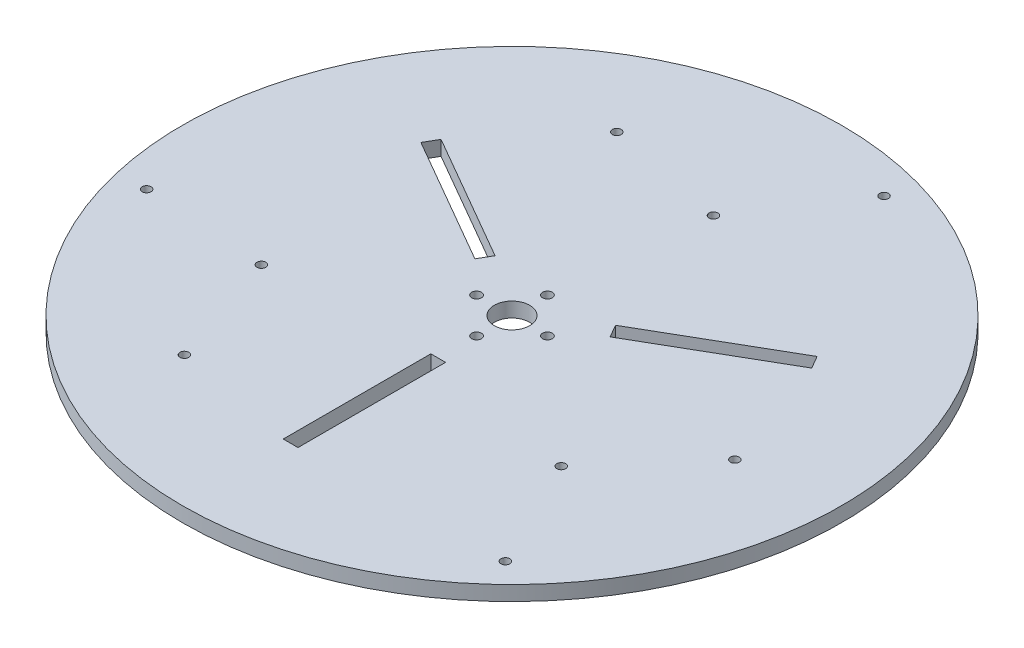
ISO-10303-21;
HEADER;
FILE_DESCRIPTION(('STEP AP214'),'2;1');
FILE_NAME('part.step','',(''),(''),'','','');
FILE_SCHEMA(('AUTOMOTIVE_DESIGN { 1 0 10303 214 1 1 1 1 }'));
ENDSEC;
DATA;
#1=APPLICATION_CONTEXT('core data for automotive mechanical design processes');
#2=APPLICATION_PROTOCOL_DEFINITION('international standard','automotive_design',2000,#1);
#3=PRODUCT_CONTEXT('',#1,'mechanical');
#4=PRODUCT('Part','Part','',(#3));
#5=PRODUCT_RELATED_PRODUCT_CATEGORY('part','',(#4));
#6=PRODUCT_DEFINITION_FORMATION('','',#4);
#7=PRODUCT_DEFINITION_CONTEXT('part definition',#1,'design');
#8=PRODUCT_DEFINITION('design','',#6,#7);
#9=PRODUCT_DEFINITION_SHAPE('','',#8);
#10=(LENGTH_UNIT() NAMED_UNIT(*) SI_UNIT(.MILLI.,.METRE.));
#11=(NAMED_UNIT(*) PLANE_ANGLE_UNIT() SI_UNIT($,.RADIAN.));
#12=(NAMED_UNIT(*) SI_UNIT($,.STERADIAN.) SOLID_ANGLE_UNIT());
#13=UNCERTAINTY_MEASURE_WITH_UNIT(LENGTH_MEASURE(1.E-05),#10,'distance_accuracy_value','');
#14=(GEOMETRIC_REPRESENTATION_CONTEXT(3) GLOBAL_UNCERTAINTY_ASSIGNED_CONTEXT((#13)) GLOBAL_UNIT_ASSIGNED_CONTEXT((#10,
#11,#12)) REPRESENTATION_CONTEXT('',''));
#15=CARTESIAN_POINT('',(0.,0.,0.));
#16=DIRECTION('',(0.,0.,1.));
#17=DIRECTION('',(1.,0.,0.));
#18=AXIS2_PLACEMENT_3D('',#15,#16,#17);
#19=CARTESIAN_POINT('',(0.,-5.,0.));
#20=DIRECTION('',(0.,1.,0.));
#21=DIRECTION('',(0.,0.,1.));
#22=AXIS2_PLACEMENT_3D('',#19,#20,#21);
#23=PLANE('',#22);
#24=CARTESIAN_POINT('',(0.,-5.,-12.));
#25=DIRECTION('',(0.,1.,0.));
#26=DIRECTION('',(0.,0.,1.));
#27=AXIS2_PLACEMENT_3D('',#24,#25,#26);
#28=CIRCLE('',#27,1.65);
#29=CARTESIAN_POINT('',(0.,-5.,-10.35));
#30=VERTEX_POINT('',#29);
#31=EDGE_CURVE('E496',#30,#30,#28,.T.);
#32=ORIENTED_EDGE('',*,*,#31,.T.);
#33=EDGE_LOOP('',(#32));
#34=FACE_BOUND('',#33,.T.);
#35=CARTESIAN_POINT('',(12.,-5.,0.));
#36=DIRECTION('',(0.,1.,0.));
#37=DIRECTION('',(0.,0.,1.));
#38=AXIS2_PLACEMENT_3D('',#35,#36,#37);
#39=CIRCLE('',#38,1.65);
#40=CARTESIAN_POINT('',(12.,-5.,1.64999999999999));
#41=VERTEX_POINT('',#40);
#42=EDGE_CURVE('E506',#41,#41,#39,.T.);
#43=ORIENTED_EDGE('',*,*,#42,.T.);
#44=EDGE_LOOP('',(#43));
#45=FACE_BOUND('',#44,.T.);
#46=CARTESIAN_POINT('',(0.,-5.,12.));
#47=DIRECTION('',(0.,1.,0.));
#48=DIRECTION('',(0.,0.,1.));
#49=AXIS2_PLACEMENT_3D('',#46,#47,#48);
#50=CIRCLE('',#49,1.65);
#51=CARTESIAN_POINT('',(0.,-5.,13.65));
#52=VERTEX_POINT('',#51);
#53=EDGE_CURVE('E512',#52,#52,#50,.T.);
#54=ORIENTED_EDGE('',*,*,#53,.T.);
#55=EDGE_LOOP('',(#54));
#56=FACE_BOUND('',#55,.T.);
#57=CARTESIAN_POINT('',(-12.,-5.,0.));
#58=DIRECTION('',(0.,1.,0.));
#59=DIRECTION('',(0.,0.,1.));
#60=AXIS2_PLACEMENT_3D('',#57,#58,#59);
#61=CIRCLE('',#60,1.65);
#62=CARTESIAN_POINT('',(-12.,-5.,1.65));
#63=VERTEX_POINT('',#62);
#64=EDGE_CURVE('E518',#63,#63,#61,.T.);
#65=ORIENTED_EDGE('',*,*,#64,.T.);
#66=EDGE_LOOP('',(#65));
#67=FACE_BOUND('',#66,.T.);
#68=CARTESIAN_POINT('',(80.0323126268361,-5.,4.54093631966197));
#69=DIRECTION('',(0.,1.,0.));
#70=DIRECTION('',(0.,0.,1.));
#71=AXIS2_PLACEMENT_3D('',#68,#69,#70);
#72=CIRCLE('',#71,1.49999999999999);
#73=CARTESIAN_POINT('',(80.0323126268361,-5.,6.04093631966196));
#74=VERTEX_POINT('',#73);
#75=EDGE_CURVE('E524',#74,#74,#72,.T.);
#76=ORIENTED_EDGE('',*,*,#75,.T.);
#77=EDGE_LOOP('',(#76));
#78=FACE_BOUND('',#77,.T.);
#79=CARTESIAN_POINT('',(52.5588445166589,-5.,35.8684225972486));
#80=DIRECTION('',(0.,1.,0.));
#81=DIRECTION('',(0.,0.,1.));
#82=AXIS2_PLACEMENT_3D('',#79,#80,#81);
#83=CIRCLE('',#82,1.49999999999999);
#84=CARTESIAN_POINT('',(52.5588445166589,-5.,37.3684225972486));
#85=VERTEX_POINT('',#84);
#86=EDGE_CURVE('E530',#85,#85,#83,.T.);
#87=ORIENTED_EDGE('',*,*,#86,.T.);
#88=EDGE_LOOP('',(#87));
#89=FACE_BOUND('',#88,.T.);
#90=CARTESIAN_POINT('',(70.9880268181769,-5.,73.2391074474209));
#91=DIRECTION('',(0.,1.,0.));
#92=DIRECTION('',(0.,0.,1.));
#93=AXIS2_PLACEMENT_3D('',#90,#91,#92);
#94=CIRCLE('',#93,1.49999999999999);
#95=CARTESIAN_POINT('',(70.9880268181769,-5.,74.7391074474209));
#96=VERTEX_POINT('',#95);
#97=EDGE_CURVE('E536',#96,#96,#94,.T.);
#98=ORIENTED_EDGE('',*,*,#97,.T.);
#99=EDGE_LOOP('',(#98));
#100=FACE_BOUND('',#99,.T.);
#101=CARTESIAN_POINT('',(-36.0835901036237,-5.,-71.580484018289));
#102=DIRECTION('',(0.,1.,0.));
#103=DIRECTION('',(0.,0.,1.));
#104=AXIS2_PLACEMENT_3D('',#101,#102,#103);
#105=CIRCLE('',#104,1.49999999999999);
#106=CARTESIAN_POINT('',(-36.0835901036237,-5.,-70.080484018289));
#107=VERTEX_POINT('',#106);
#108=EDGE_CURVE('E542',#107,#107,#105,.T.);
#109=ORIENTED_EDGE('',*,*,#108,.T.);
#110=EDGE_LOOP('',(#109));
#111=FACE_BOUND('',#110,.T.);
#112=CARTESIAN_POINT('',(4.7835429045634,-5.,-63.4515058436074));
#113=DIRECTION('',(0.,1.,0.));
#114=DIRECTION('',(0.,0.,1.));
#115=AXIS2_PLACEMENT_3D('',#112,#113,#114);
#116=CIRCLE('',#115,1.49999999999999);
#117=CARTESIAN_POINT('',(4.7835429045634,-5.,-61.9515058436074));
#118=VERTEX_POINT('',#117);
#119=EDGE_CURVE('E548',#118,#118,#116,.T.);
#120=ORIENTED_EDGE('',*,*,#119,.T.);
#121=EDGE_LOOP('',(#120));
#122=FACE_BOUND('',#121,.T.);
#123=CARTESIAN_POINT('',(27.9329141908757,-5.,-98.0969883127829));
#124=DIRECTION('',(0.,1.,0.));
#125=DIRECTION('',(0.,0.,1.));
#126=AXIS2_PLACEMENT_3D('',#123,#124,#125);
#127=CIRCLE('',#126,1.49999999999999);
#128=CARTESIAN_POINT('',(27.9329141908757,-5.,-96.5969883127829));
#129=VERTEX_POINT('',#128);
#130=EDGE_CURVE('E554',#129,#129,#127,.T.);
#131=ORIENTED_EDGE('',*,*,#130,.T.);
#132=EDGE_LOOP('',(#131));
#133=FACE_BOUND('',#132,.T.);
#134=CARTESIAN_POINT('',(-43.9487225232121,-5.,67.0395476986276));
#135=DIRECTION('',(0.,1.,0.));
#136=DIRECTION('',(0.,0.,1.));
#137=AXIS2_PLACEMENT_3D('',#134,#135,#136);
#138=CIRCLE('',#137,1.49999999999999);
#139=CARTESIAN_POINT('',(-43.9487225232121,-5.,68.5395476986276));
#140=VERTEX_POINT('',#139);
#141=EDGE_CURVE('E560',#140,#140,#138,.T.);
#142=ORIENTED_EDGE('',*,*,#141,.T.);
#143=EDGE_LOOP('',(#142));
#144=FACE_BOUND('',#143,.T.);
#145=CARTESIAN_POINT('',(-57.3423874212223,-5.,27.5830832463593));
#146=DIRECTION('',(0.,1.,0.));
#147=DIRECTION('',(0.,0.,1.));
#148=AXIS2_PLACEMENT_3D('',#145,#146,#147);
#149=CIRCLE('',#148,1.49999999999999);
#150=CARTESIAN_POINT('',(-57.3423874212223,-5.,29.0830832463593));
#151=VERTEX_POINT('',#150);
#152=EDGE_CURVE('E566',#151,#151,#149,.T.);
#153=ORIENTED_EDGE('',*,*,#152,.T.);
#154=EDGE_LOOP('',(#153));
#155=FACE_BOUND('',#154,.T.);
#156=CARTESIAN_POINT('',(-98.9209410090528,-5.,24.8578808653627));
#157=DIRECTION('',(0.,1.,0.));
#158=DIRECTION('',(0.,0.,1.));
#159=AXIS2_PLACEMENT_3D('',#156,#157,#158);
#160=CIRCLE('',#159,1.49999999999999);
#161=CARTESIAN_POINT('',(-98.9209410090528,-5.,26.3578808653627));
#162=VERTEX_POINT('',#161);
#163=EDGE_CURVE('E572',#162,#162,#160,.T.);
#164=ORIENTED_EDGE('',*,*,#163,.T.);
#165=EDGE_LOOP('',(#164));
#166=FACE_BOUND('',#165,.T.);
#167=DIRECTION('',(-0.500000000000002,0.,-0.866025403784437));
#168=VECTOR('',#167,1.);
#169=CARTESIAN_POINT('',(21.6506350946136,-5.,-12.5000000000016));
#170=LINE('',#169,#168);
#171=CARTESIAN_POINT('',(22.9006350946148,-5.,-10.3349364905385));
#172=VERTEX_POINT('',#171);
#173=CARTESIAN_POINT('',(20.4006350946148,-5.,-14.6650635094607));
#174=VERTEX_POINT('',#173);
#175=EDGE_CURVE('E312',#172,#174,#170,.T.);
#176=ORIENTED_EDGE('',*,*,#175,.F.);
#177=DIRECTION('',(-0.866025403784437,0.,0.500000000000002));
#178=VECTOR('',#177,1.);
#179=CARTESIAN_POINT('',(1.25000000000119,-5.,2.16506350946314));
#180=LINE('',#179,#178);
#181=CARTESIAN_POINT('',(66.2019052838367,-5.,-35.3349364905386));
#182=VERTEX_POINT('',#181);
#183=EDGE_CURVE('E314',#182,#172,#180,.T.);
#184=ORIENTED_EDGE('',*,*,#183,.F.);
#185=DIRECTION('',(-0.500000000000002,0.,-0.866025403784437));
#186=VECTOR('',#185,1.);
#187=CARTESIAN_POINT('',(64.9519052838355,-5.,-37.5000000000017));
#188=LINE('',#187,#186);
#189=CARTESIAN_POINT('',(63.7019052838367,-5.,-39.6650635094608));
#190=VERTEX_POINT('',#189);
#191=EDGE_CURVE('E197',#182,#190,#188,.T.);
#192=ORIENTED_EDGE('',*,*,#191,.T.);
#193=DIRECTION('',(-0.866025403784437,0.,0.500000000000002));
#194=VECTOR('',#193,1.);
#195=CARTESIAN_POINT('',(-1.24999999999882,-5.,-2.16506350945905));
#196=LINE('',#195,#194);
#197=EDGE_CURVE('E317',#190,#174,#196,.T.);
#198=ORIENTED_EDGE('',*,*,#197,.T.);
#199=EDGE_LOOP('',(#176,#184,#192,#198));
#200=FACE_BOUND('',#199,.T.);
#201=DIRECTION('',(1.,0.,0.));
#202=VECTOR('',#201,1.);
#203=CARTESIAN_POINT('',(0.,-5.,25.0000000000036));
#204=LINE('',#203,#202);
#205=CARTESIAN_POINT('',(-2.4999999999984,-5.,25.0000000000036));
#206=VERTEX_POINT('',#205);
#207=CARTESIAN_POINT('',(2.5000000000016,-5.,25.0000000000036));
#208=VERTEX_POINT('',#207);
#209=EDGE_CURVE('E280',#206,#208,#204,.T.);
#210=ORIENTED_EDGE('',*,*,#209,.F.);
#211=DIRECTION('',(0.,0.,-1.));
#212=VECTOR('',#211,1.);
#213=CARTESIAN_POINT('',(-2.49999999999848,-5.,0.));
#214=LINE('',#213,#212);
#215=CARTESIAN_POINT('',(-2.49999999999825,-5.,75.0000000000036));
#216=VERTEX_POINT('',#215);
#217=EDGE_CURVE('E272',#216,#206,#214,.T.);
#218=ORIENTED_EDGE('',*,*,#217,.F.);
#219=DIRECTION('',(1.,0.,0.));
#220=VECTOR('',#219,1.);
#221=CARTESIAN_POINT('',(0.,-5.,75.0000000000036));
#222=LINE('',#221,#220);
#223=CARTESIAN_POINT('',(2.50000000000176,-5.,75.0000000000036));
#224=VERTEX_POINT('',#223);
#225=EDGE_CURVE('E205',#216,#224,#222,.T.);
#226=ORIENTED_EDGE('',*,*,#225,.T.);
#227=DIRECTION('',(0.,0.,-1.));
#228=VECTOR('',#227,1.);
#229=CARTESIAN_POINT('',(2.50000000000152,-5.,0.));
#230=LINE('',#229,#228);
#231=EDGE_CURVE('E289',#224,#208,#230,.T.);
#232=ORIENTED_EDGE('',*,*,#231,.T.);
#233=EDGE_LOOP('',(#210,#218,#226,#232));
#234=FACE_BOUND('',#233,.T.);
#235=DIRECTION('',(-0.499999999999998,0.,0.86602540378444));
#236=VECTOR('',#235,1.);
#237=CARTESIAN_POINT('',(-21.650635094611,-5.,-12.4999999999999));
#238=LINE('',#237,#236);
#239=CARTESIAN_POINT('',(-20.400635094611,-5.,-14.665063509461));
#240=VERTEX_POINT('',#239);
#241=CARTESIAN_POINT('',(-22.900635094611,-5.,-10.3349364905388));
#242=VERTEX_POINT('',#241);
#243=EDGE_CURVE('E307',#240,#242,#238,.T.);
#244=ORIENTED_EDGE('',*,*,#243,.F.);
#245=DIRECTION('',(0.86602540378444,0.,0.499999999999998));
#246=VECTOR('',#245,1.);
#247=CARTESIAN_POINT('',(1.25,-5.,-2.1650635094611));
#248=LINE('',#247,#246);
#249=CARTESIAN_POINT('',(-63.701905283833,-5.,-39.6650635094609));
#250=VERTEX_POINT('',#249);
#251=EDGE_CURVE('E327',#250,#240,#248,.T.);
#252=ORIENTED_EDGE('',*,*,#251,.F.);
#253=DIRECTION('',(-0.500000000000001,0.,0.866025403784438));
#254=VECTOR('',#253,1.);
#255=CARTESIAN_POINT('',(-64.9519052838329,-5.,-37.5));
#256=LINE('',#255,#254);
#257=CARTESIAN_POINT('',(-66.201905283833,-5.,-35.3349364905387));
#258=VERTEX_POINT('',#257);
#259=EDGE_CURVE('E329',#250,#258,#256,.T.);
#260=ORIENTED_EDGE('',*,*,#259,.T.);
#261=DIRECTION('',(0.86602540378444,0.,0.499999999999997));
#262=VECTOR('',#261,1.);
#263=CARTESIAN_POINT('',(-1.24999999999999,-5.,2.16506350946109));
#264=LINE('',#263,#262);
#265=EDGE_CURVE('E332',#258,#242,#264,.T.);
#266=ORIENTED_EDGE('',*,*,#265,.T.);
#267=EDGE_LOOP('',(#244,#252,#260,#266));
#268=FACE_BOUND('',#267,.T.);
#269=CARTESIAN_POINT('',(0.,-5.,0.));
#270=DIRECTION('',(0.,1.,0.));
#271=DIRECTION('',(0.,0.,1.));
#272=AXIS2_PLACEMENT_3D('',#269,#270,#271);
#273=CIRCLE('',#272,6.);
#274=CARTESIAN_POINT('',(0.,-5.,6.));
#275=VERTEX_POINT('',#274);
#276=EDGE_CURVE('E347',#275,#275,#273,.T.);
#277=ORIENTED_EDGE('',*,*,#276,.T.);
#278=EDGE_LOOP('',(#277));
#279=FACE_BOUND('',#278,.T.);
#280=CARTESIAN_POINT('',(0.,-5.,0.));
#281=DIRECTION('',(0.,1.,0.));
#282=DIRECTION('',(0.,0.,1.));
#283=AXIS2_PLACEMENT_3D('',#280,#281,#282);
#284=CIRCLE('',#283,111.647689530454);
#285=CARTESIAN_POINT('',(0.,-5.,111.647689530454));
#286=VERTEX_POINT('',#285);
#287=EDGE_CURVE('E300',#286,#286,#284,.F.);
#288=ORIENTED_EDGE('',*,*,#287,.T.);
#289=EDGE_LOOP('',(#288));
#290=FACE_BOUND('',#289,.T.);
#291=ADVANCED_FACE('F182',(#34,#45,#56,#67,#78,#89,#100,#111,#122,#133,#144,#155,#166,#200,#234,
#268,#279,#290),#23,.F.);
#292=CARTESIAN_POINT('',(0.,0.,0.));
#293=DIRECTION('',(0.,1.,0.));
#294=DIRECTION('',(0.,0.,1.));
#295=AXIS2_PLACEMENT_3D('',#292,#293,#294);
#296=PLANE('',#295);
#297=CARTESIAN_POINT('',(0.,0.,-12.));
#298=DIRECTION('',(0.,1.,0.));
#299=DIRECTION('',(0.,0.,1.));
#300=AXIS2_PLACEMENT_3D('',#297,#298,#299);
#301=CIRCLE('',#300,1.65);
#302=CARTESIAN_POINT('',(0.,0.,-10.35));
#303=VERTEX_POINT('',#302);
#304=EDGE_CURVE('E499',#303,#303,#301,.T.);
#305=ORIENTED_EDGE('',*,*,#304,.F.);
#306=EDGE_LOOP('',(#305));
#307=FACE_BOUND('',#306,.T.);
#308=CARTESIAN_POINT('',(12.,0.,0.));
#309=DIRECTION('',(0.,1.,0.));
#310=DIRECTION('',(0.,0.,1.));
#311=AXIS2_PLACEMENT_3D('',#308,#309,#310);
#312=CIRCLE('',#311,1.65);
#313=CARTESIAN_POINT('',(12.,0.,1.64999999999999));
#314=VERTEX_POINT('',#313);
#315=EDGE_CURVE('E501',#314,#314,#312,.T.);
#316=ORIENTED_EDGE('',*,*,#315,.F.);
#317=EDGE_LOOP('',(#316));
#318=FACE_BOUND('',#317,.T.);
#319=CARTESIAN_POINT('',(0.,0.,12.));
#320=DIRECTION('',(0.,1.,0.));
#321=DIRECTION('',(0.,0.,1.));
#322=AXIS2_PLACEMENT_3D('',#319,#320,#321);
#323=CIRCLE('',#322,1.65);
#324=CARTESIAN_POINT('',(0.,0.,13.65));
#325=VERTEX_POINT('',#324);
#326=EDGE_CURVE('E509',#325,#325,#323,.T.);
#327=ORIENTED_EDGE('',*,*,#326,.F.);
#328=EDGE_LOOP('',(#327));
#329=FACE_BOUND('',#328,.T.);
#330=CARTESIAN_POINT('',(-12.,0.,0.));
#331=DIRECTION('',(0.,1.,0.));
#332=DIRECTION('',(0.,0.,1.));
#333=AXIS2_PLACEMENT_3D('',#330,#331,#332);
#334=CIRCLE('',#333,1.65);
#335=CARTESIAN_POINT('',(-12.,0.,1.65));
#336=VERTEX_POINT('',#335);
#337=EDGE_CURVE('E515',#336,#336,#334,.T.);
#338=ORIENTED_EDGE('',*,*,#337,.F.);
#339=EDGE_LOOP('',(#338));
#340=FACE_BOUND('',#339,.T.);
#341=CARTESIAN_POINT('',(80.0323126268361,0.,4.54093631966197));
#342=DIRECTION('',(0.,1.,0.));
#343=DIRECTION('',(0.,0.,1.));
#344=AXIS2_PLACEMENT_3D('',#341,#342,#343);
#345=CIRCLE('',#344,1.49999999999999);
#346=CARTESIAN_POINT('',(80.0323126268361,0.,6.04093631966195));
#347=VERTEX_POINT('',#346);
#348=EDGE_CURVE('E521',#347,#347,#345,.T.);
#349=ORIENTED_EDGE('',*,*,#348,.F.);
#350=EDGE_LOOP('',(#349));
#351=FACE_BOUND('',#350,.T.);
#352=CARTESIAN_POINT('',(52.5588445166589,0.,35.8684225972486));
#353=DIRECTION('',(0.,1.,0.));
#354=DIRECTION('',(0.,0.,1.));
#355=AXIS2_PLACEMENT_3D('',#352,#353,#354);
#356=CIRCLE('',#355,1.49999999999999);
#357=CARTESIAN_POINT('',(52.5588445166589,0.,37.3684225972486));
#358=VERTEX_POINT('',#357);
#359=EDGE_CURVE('E527',#358,#358,#356,.T.);
#360=ORIENTED_EDGE('',*,*,#359,.F.);
#361=EDGE_LOOP('',(#360));
#362=FACE_BOUND('',#361,.T.);
#363=CARTESIAN_POINT('',(70.9880268181769,0.,73.2391074474209));
#364=DIRECTION('',(0.,1.,0.));
#365=DIRECTION('',(0.,0.,1.));
#366=AXIS2_PLACEMENT_3D('',#363,#364,#365);
#367=CIRCLE('',#366,1.49999999999999);
#368=CARTESIAN_POINT('',(70.9880268181769,0.,74.7391074474209));
#369=VERTEX_POINT('',#368);
#370=EDGE_CURVE('E533',#369,#369,#367,.T.);
#371=ORIENTED_EDGE('',*,*,#370,.F.);
#372=EDGE_LOOP('',(#371));
#373=FACE_BOUND('',#372,.T.);
#374=CARTESIAN_POINT('',(-36.0835901036237,0.,-71.580484018289));
#375=DIRECTION('',(0.,1.,0.));
#376=DIRECTION('',(0.,0.,1.));
#377=AXIS2_PLACEMENT_3D('',#374,#375,#376);
#378=CIRCLE('',#377,1.49999999999999);
#379=CARTESIAN_POINT('',(-36.0835901036237,0.,-70.080484018289));
#380=VERTEX_POINT('',#379);
#381=EDGE_CURVE('E539',#380,#380,#378,.T.);
#382=ORIENTED_EDGE('',*,*,#381,.F.);
#383=EDGE_LOOP('',(#382));
#384=FACE_BOUND('',#383,.T.);
#385=CARTESIAN_POINT('',(4.7835429045634,0.,-63.4515058436074));
#386=DIRECTION('',(0.,1.,0.));
#387=DIRECTION('',(0.,0.,1.));
#388=AXIS2_PLACEMENT_3D('',#385,#386,#387);
#389=CIRCLE('',#388,1.49999999999999);
#390=CARTESIAN_POINT('',(4.7835429045634,0.,-61.9515058436074));
#391=VERTEX_POINT('',#390);
#392=EDGE_CURVE('E545',#391,#391,#389,.T.);
#393=ORIENTED_EDGE('',*,*,#392,.F.);
#394=EDGE_LOOP('',(#393));
#395=FACE_BOUND('',#394,.T.);
#396=CARTESIAN_POINT('',(27.9329141908757,0.,-98.0969883127829));
#397=DIRECTION('',(0.,1.,0.));
#398=DIRECTION('',(0.,0.,1.));
#399=AXIS2_PLACEMENT_3D('',#396,#397,#398);
#400=CIRCLE('',#399,1.49999999999999);
#401=CARTESIAN_POINT('',(27.9329141908757,0.,-96.5969883127829));
#402=VERTEX_POINT('',#401);
#403=EDGE_CURVE('E551',#402,#402,#400,.T.);
#404=ORIENTED_EDGE('',*,*,#403,.F.);
#405=EDGE_LOOP('',(#404));
#406=FACE_BOUND('',#405,.T.);
#407=CARTESIAN_POINT('',(-43.9487225232121,0.,67.0395476986276));
#408=DIRECTION('',(0.,1.,0.));
#409=DIRECTION('',(0.,0.,1.));
#410=AXIS2_PLACEMENT_3D('',#407,#408,#409);
#411=CIRCLE('',#410,1.49999999999999);
#412=CARTESIAN_POINT('',(-43.9487225232121,0.,68.5395476986276));
#413=VERTEX_POINT('',#412);
#414=EDGE_CURVE('E557',#413,#413,#411,.T.);
#415=ORIENTED_EDGE('',*,*,#414,.F.);
#416=EDGE_LOOP('',(#415));
#417=FACE_BOUND('',#416,.T.);
#418=CARTESIAN_POINT('',(-57.3423874212223,0.,27.5830832463593));
#419=DIRECTION('',(0.,1.,0.));
#420=DIRECTION('',(0.,0.,1.));
#421=AXIS2_PLACEMENT_3D('',#418,#419,#420);
#422=CIRCLE('',#421,1.49999999999999);
#423=CARTESIAN_POINT('',(-57.3423874212223,0.,29.0830832463592));
#424=VERTEX_POINT('',#423);
#425=EDGE_CURVE('E563',#424,#424,#422,.T.);
#426=ORIENTED_EDGE('',*,*,#425,.F.);
#427=EDGE_LOOP('',(#426));
#428=FACE_BOUND('',#427,.T.);
#429=CARTESIAN_POINT('',(-98.9209410090528,0.,24.8578808653627));
#430=DIRECTION('',(0.,1.,0.));
#431=DIRECTION('',(0.,0.,1.));
#432=AXIS2_PLACEMENT_3D('',#429,#430,#431);
#433=CIRCLE('',#432,1.49999999999999);
#434=CARTESIAN_POINT('',(-98.9209410090528,0.,26.3578808653627));
#435=VERTEX_POINT('',#434);
#436=EDGE_CURVE('E569',#435,#435,#433,.T.);
#437=ORIENTED_EDGE('',*,*,#436,.F.);
#438=EDGE_LOOP('',(#437));
#439=FACE_BOUND('',#438,.T.);
#440=DIRECTION('',(-0.866025403784437,0.,0.500000000000002));
#441=VECTOR('',#440,1.);
#442=CARTESIAN_POINT('',(1.25000000000119,0.,2.16506350946314));
#443=LINE('',#442,#441);
#444=CARTESIAN_POINT('',(66.2019052838367,0.,-35.3349364905386));
#445=VERTEX_POINT('',#444);
#446=CARTESIAN_POINT('',(22.9006350946148,0.,-10.3349364905385));
#447=VERTEX_POINT('',#446);
#448=EDGE_CURVE('E369',#445,#447,#443,.T.);
#449=ORIENTED_EDGE('',*,*,#448,.T.);
#450=DIRECTION('',(-0.500000000000002,0.,-0.866025403784437));
#451=VECTOR('',#450,1.);
#452=CARTESIAN_POINT('',(21.6506350946136,0.,-12.5000000000016));
#453=LINE('',#452,#451);
#454=CARTESIAN_POINT('',(20.4006350946148,0.,-14.6650635094607));
#455=VERTEX_POINT('',#454);
#456=EDGE_CURVE('E12',#447,#455,#453,.T.);
#457=ORIENTED_EDGE('',*,*,#456,.T.);
#458=DIRECTION('',(-0.866025403784437,0.,0.500000000000002));
#459=VECTOR('',#458,1.);
#460=CARTESIAN_POINT('',(-1.24999999999882,0.,-2.16506350945905));
#461=LINE('',#460,#459);
#462=CARTESIAN_POINT('',(63.7019052838367,0.,-39.6650635094608));
#463=VERTEX_POINT('',#462);
#464=EDGE_CURVE('E190',#463,#455,#461,.T.);
#465=ORIENTED_EDGE('',*,*,#464,.F.);
#466=DIRECTION('',(-0.500000000000002,0.,-0.866025403784437));
#467=VECTOR('',#466,1.);
#468=CARTESIAN_POINT('',(64.9519052838355,0.,-37.5000000000017));
#469=LINE('',#468,#467);
#470=EDGE_CURVE('E372',#445,#463,#469,.T.);
#471=ORIENTED_EDGE('',*,*,#470,.F.);
#472=EDGE_LOOP('',(#449,#457,#465,#471));
#473=FACE_BOUND('',#472,.T.);
#474=DIRECTION('',(0.,0.,-1.));
#475=VECTOR('',#474,1.);
#476=CARTESIAN_POINT('',(-2.49999999999848,0.,0.));
#477=LINE('',#476,#475);
#478=CARTESIAN_POINT('',(-2.49999999999825,0.,75.0000000000036));
#479=VERTEX_POINT('',#478);
#480=CARTESIAN_POINT('',(-2.4999999999984,0.,25.0000000000036));
#481=VERTEX_POINT('',#480);
#482=EDGE_CURVE('E362',#479,#481,#477,.T.);
#483=ORIENTED_EDGE('',*,*,#482,.T.);
#484=DIRECTION('',(1.,0.,0.));
#485=VECTOR('',#484,1.);
#486=CARTESIAN_POINT('',(0.,0.,25.0000000000036));
#487=LINE('',#486,#485);
#488=CARTESIAN_POINT('',(2.5000000000016,0.,25.0000000000036));
#489=VERTEX_POINT('',#488);
#490=EDGE_CURVE('E287',#481,#489,#487,.T.);
#491=ORIENTED_EDGE('',*,*,#490,.T.);
#492=DIRECTION('',(0.,0.,-1.));
#493=VECTOR('',#492,1.);
#494=CARTESIAN_POINT('',(2.50000000000152,0.,0.));
#495=LINE('',#494,#493);
#496=CARTESIAN_POINT('',(2.50000000000176,0.,75.0000000000036));
#497=VERTEX_POINT('',#496);
#498=EDGE_CURVE('E366',#497,#489,#495,.T.);
#499=ORIENTED_EDGE('',*,*,#498,.F.);
#500=DIRECTION('',(1.,0.,0.));
#501=VECTOR('',#500,1.);
#502=CARTESIAN_POINT('',(0.,0.,75.0000000000036));
#503=LINE('',#502,#501);
#504=EDGE_CURVE('E364',#479,#497,#503,.T.);
#505=ORIENTED_EDGE('',*,*,#504,.F.);
#506=EDGE_LOOP('',(#483,#491,#499,#505));
#507=FACE_BOUND('',#506,.T.);
#508=DIRECTION('',(0.86602540378444,0.,0.499999999999998));
#509=VECTOR('',#508,1.);
#510=CARTESIAN_POINT('',(1.25,0.,-2.1650635094611));
#511=LINE('',#510,#509);
#512=CARTESIAN_POINT('',(-63.701905283833,0.,-39.6650635094609));
#513=VERTEX_POINT('',#512);
#514=CARTESIAN_POINT('',(-20.400635094611,0.,-14.665063509461));
#515=VERTEX_POINT('',#514);
#516=EDGE_CURVE('E350',#513,#515,#511,.T.);
#517=ORIENTED_EDGE('',*,*,#516,.T.);
#518=DIRECTION('',(-0.499999999999998,0.,0.86602540378444));
#519=VECTOR('',#518,1.);
#520=CARTESIAN_POINT('',(-21.650635094611,0.,-12.4999999999999));
#521=LINE('',#520,#519);
#522=CARTESIAN_POINT('',(-22.900635094611,0.,-10.3349364905388));
#523=VERTEX_POINT('',#522);
#524=EDGE_CURVE('E359',#515,#523,#521,.T.);
#525=ORIENTED_EDGE('',*,*,#524,.T.);
#526=DIRECTION('',(0.86602540378444,0.,0.499999999999997));
#527=VECTOR('',#526,1.);
#528=CARTESIAN_POINT('',(-1.24999999999999,0.,2.16506350946109));
#529=LINE('',#528,#527);
#530=CARTESIAN_POINT('',(-66.201905283833,0.,-35.3349364905387));
#531=VERTEX_POINT('',#530);
#532=EDGE_CURVE('E357',#531,#523,#529,.T.);
#533=ORIENTED_EDGE('',*,*,#532,.F.);
#534=DIRECTION('',(-0.500000000000001,0.,0.866025403784438));
#535=VECTOR('',#534,1.);
#536=CARTESIAN_POINT('',(-64.9519052838329,0.,-37.5));
#537=LINE('',#536,#535);
#538=EDGE_CURVE('E355',#513,#531,#537,.T.);
#539=ORIENTED_EDGE('',*,*,#538,.F.);
#540=EDGE_LOOP('',(#517,#525,#533,#539));
#541=FACE_BOUND('',#540,.T.);
#542=CARTESIAN_POINT('',(0.,0.,0.));
#543=DIRECTION('',(0.,1.,0.));
#544=DIRECTION('',(0.,0.,1.));
#545=AXIS2_PLACEMENT_3D('',#542,#543,#544);
#546=CIRCLE('',#545,6.);
#547=CARTESIAN_POINT('',(0.,0.,6.));
#548=VERTEX_POINT('',#547);
#549=EDGE_CURVE('E339',#548,#548,#546,.T.);
#550=ORIENTED_EDGE('',*,*,#549,.F.);
#551=EDGE_LOOP('',(#550));
#552=FACE_BOUND('',#551,.T.);
#553=CARTESIAN_POINT('',(0.,0.,0.));
#554=DIRECTION('',(0.,1.,0.));
#555=DIRECTION('',(0.,0.,1.));
#556=AXIS2_PLACEMENT_3D('',#553,#554,#555);
#557=CIRCLE('',#556,111.647689530454);
#558=CARTESIAN_POINT('',(0.,0.,111.647689530454));
#559=VERTEX_POINT('',#558);
#560=EDGE_CURVE('E574',#559,#559,#557,.T.);
#561=ORIENTED_EDGE('',*,*,#560,.T.);
#562=EDGE_LOOP('',(#561));
#563=FACE_BOUND('',#562,.T.);
#564=ADVANCED_FACE('F385',(#307,#318,#329,#340,#351,#362,#373,#384,#395,#406,#417,#428,#439,
#473,#507,#541,#552,#563),#296,.T.);
#565=CARTESIAN_POINT('',(0.,-5.,0.));
#566=DIRECTION('',(0.,1.,0.));
#567=DIRECTION('',(0.,0.,1.));
#568=AXIS2_PLACEMENT_3D('',#565,#566,#567);
#569=CYLINDRICAL_SURFACE('',#568,6.);
#570=ORIENTED_EDGE('',*,*,#276,.F.);
#571=EDGE_LOOP('',(#570));
#572=FACE_BOUND('',#571,.T.);
#573=ORIENTED_EDGE('',*,*,#549,.T.);
#574=EDGE_LOOP('',(#573));
#575=FACE_BOUND('',#574,.T.);
#576=ADVANCED_FACE('F184',(#572,#575),#569,.F.);
#577=CARTESIAN_POINT('',(-21.650635094611,-5.,-12.4999999999999));
#578=DIRECTION('',(-0.86602540378444,0.,-0.499999999999998));
#579=DIRECTION('',(-0.499999999999998,0.,0.86602540378444));
#580=AXIS2_PLACEMENT_3D('',#577,#578,#579);
#581=PLANE('',#580);
#582=DIRECTION('',(0.,1.,0.));
#583=VECTOR('',#582,1.);
#584=CARTESIAN_POINT('',(-20.400635094611,-5.,-14.665063509461));
#585=LINE('',#584,#583);
#586=EDGE_CURVE('E335',#240,#515,#585,.T.);
#587=ORIENTED_EDGE('',*,*,#586,.F.);
#588=ORIENTED_EDGE('',*,*,#243,.T.);
#589=DIRECTION('',(0.,1.,0.));
#590=VECTOR('',#589,1.);
#591=CARTESIAN_POINT('',(-22.900635094611,-5.,-10.3349364905388));
#592=LINE('',#591,#590);
#593=EDGE_CURVE('E336',#242,#523,#592,.T.);
#594=ORIENTED_EDGE('',*,*,#593,.T.);
#595=ORIENTED_EDGE('',*,*,#524,.F.);
#596=EDGE_LOOP('',(#587,#588,#594,#595));
#597=FACE_BOUND('',#596,.T.);
#598=ADVANCED_FACE('F402',(#597),#581,.T.);
#599=CARTESIAN_POINT('',(-1.24999999999999,-5.,2.16506350946109));
#600=DIRECTION('',(-0.499999999999997,0.,0.86602540378444));
#601=DIRECTION('',(0.86602540378444,0.,0.499999999999997));
#602=AXIS2_PLACEMENT_3D('',#599,#600,#601);
#603=PLANE('',#602);
#604=ORIENTED_EDGE('',*,*,#532,.T.);
#605=ORIENTED_EDGE('',*,*,#593,.F.);
#606=ORIENTED_EDGE('',*,*,#265,.F.);
#607=DIRECTION('',(0.,1.,0.));
#608=VECTOR('',#607,1.);
#609=CARTESIAN_POINT('',(-66.201905283833,-5.,-35.3349364905387));
#610=LINE('',#609,#608);
#611=EDGE_CURVE('E340',#258,#531,#610,.T.);
#612=ORIENTED_EDGE('',*,*,#611,.T.);
#613=EDGE_LOOP('',(#604,#605,#606,#612));
#614=FACE_BOUND('',#613,.T.);
#615=ADVANCED_FACE('F405',(#614),#603,.F.);
#616=CARTESIAN_POINT('',(-64.9519052838329,-5.,-37.5));
#617=DIRECTION('',(-0.866025403784438,0.,-0.500000000000001));
#618=DIRECTION('',(-0.500000000000001,0.,0.866025403784438));
#619=AXIS2_PLACEMENT_3D('',#616,#617,#618);
#620=PLANE('',#619);
#621=ORIENTED_EDGE('',*,*,#538,.T.);
#622=ORIENTED_EDGE('',*,*,#611,.F.);
#623=ORIENTED_EDGE('',*,*,#259,.F.);
#624=DIRECTION('',(0.,1.,0.));
#625=VECTOR('',#624,1.);
#626=CARTESIAN_POINT('',(-63.701905283833,-5.,-39.6650635094609));
#627=LINE('',#626,#625);
#628=EDGE_CURVE('E343',#250,#513,#627,.T.);
#629=ORIENTED_EDGE('',*,*,#628,.T.);
#630=EDGE_LOOP('',(#621,#622,#623,#629));
#631=FACE_BOUND('',#630,.T.);
#632=ADVANCED_FACE('F410',(#631),#620,.F.);
#633=CARTESIAN_POINT('',(1.25,-5.,-2.1650635094611));
#634=DIRECTION('',(-0.499999999999998,0.,0.86602540378444));
#635=DIRECTION('',(0.86602540378444,0.,0.499999999999998));
#636=AXIS2_PLACEMENT_3D('',#633,#634,#635);
#637=PLANE('',#636);
#638=ORIENTED_EDGE('',*,*,#628,.F.);
#639=ORIENTED_EDGE('',*,*,#251,.T.);
#640=ORIENTED_EDGE('',*,*,#586,.T.);
#641=ORIENTED_EDGE('',*,*,#516,.F.);
#642=EDGE_LOOP('',(#638,#639,#640,#641));
#643=FACE_BOUND('',#642,.T.);
#644=ADVANCED_FACE('F407',(#643),#637,.T.);
#645=CARTESIAN_POINT('',(0.,-5.,25.0000000000036));
#646=DIRECTION('',(0.,0.,1.));
#647=DIRECTION('',(1.,0.,0.));
#648=AXIS2_PLACEMENT_3D('',#645,#646,#647);
#649=PLANE('',#648);
#650=DIRECTION('',(0.,1.,0.));
#651=VECTOR('',#650,1.);
#652=CARTESIAN_POINT('',(-2.4999999999984,-5.,25.0000000000036));
#653=LINE('',#652,#651);
#654=EDGE_CURVE('E275',#206,#481,#653,.T.);
#655=ORIENTED_EDGE('',*,*,#654,.F.);
#656=ORIENTED_EDGE('',*,*,#209,.T.);
#657=DIRECTION('',(0.,1.,0.));
#658=VECTOR('',#657,1.);
#659=CARTESIAN_POINT('',(2.5000000000016,-5.,25.0000000000036));
#660=LINE('',#659,#658);
#661=EDGE_CURVE('E305',#208,#489,#660,.T.);
#662=ORIENTED_EDGE('',*,*,#661,.T.);
#663=ORIENTED_EDGE('',*,*,#490,.F.);
#664=EDGE_LOOP('',(#655,#656,#662,#663));
#665=FACE_BOUND('',#664,.T.);
#666=ADVANCED_FACE('F283',(#665),#649,.T.);
#667=CARTESIAN_POINT('',(2.50000000000152,-5.,0.));
#668=DIRECTION('',(1.,0.,0.));
#669=DIRECTION('',(0.,0.,-1.));
#670=AXIS2_PLACEMENT_3D('',#667,#668,#669);
#671=PLANE('',#670);
#672=ORIENTED_EDGE('',*,*,#498,.T.);
#673=ORIENTED_EDGE('',*,*,#661,.F.);
#674=ORIENTED_EDGE('',*,*,#231,.F.);
#675=DIRECTION('',(0.,1.,0.));
#676=VECTOR('',#675,1.);
#677=CARTESIAN_POINT('',(2.50000000000176,-5.,75.0000000000036));
#678=LINE('',#677,#676);
#679=EDGE_CURVE('E308',#224,#497,#678,.T.);
#680=ORIENTED_EDGE('',*,*,#679,.T.);
#681=EDGE_LOOP('',(#672,#673,#674,#680));
#682=FACE_BOUND('',#681,.T.);
#683=ADVANCED_FACE('F429',(#682),#671,.F.);
#684=CARTESIAN_POINT('',(0.,-5.,75.0000000000036));
#685=DIRECTION('',(0.,0.,1.));
#686=DIRECTION('',(1.,0.,0.));
#687=AXIS2_PLACEMENT_3D('',#684,#685,#686);
#688=PLANE('',#687);
#689=ORIENTED_EDGE('',*,*,#504,.T.);
#690=ORIENTED_EDGE('',*,*,#679,.F.);
#691=ORIENTED_EDGE('',*,*,#225,.F.);
#692=DIRECTION('',(0.,1.,0.));
#693=VECTOR('',#692,1.);
#694=CARTESIAN_POINT('',(-2.49999999999825,-5.,75.0000000000036));
#695=LINE('',#694,#693);
#696=EDGE_CURVE('E277',#216,#479,#695,.T.);
#697=ORIENTED_EDGE('',*,*,#696,.T.);
#698=EDGE_LOOP('',(#689,#690,#691,#697));
#699=FACE_BOUND('',#698,.T.);
#700=ADVANCED_FACE('F432',(#699),#688,.F.);
#701=CARTESIAN_POINT('',(-2.49999999999848,-5.,0.));
#702=DIRECTION('',(1.,0.,0.));
#703=DIRECTION('',(0.,0.,-1.));
#704=AXIS2_PLACEMENT_3D('',#701,#702,#703);
#705=PLANE('',#704);
#706=ORIENTED_EDGE('',*,*,#696,.F.);
#707=ORIENTED_EDGE('',*,*,#217,.T.);
#708=ORIENTED_EDGE('',*,*,#654,.T.);
#709=ORIENTED_EDGE('',*,*,#482,.F.);
#710=EDGE_LOOP('',(#706,#707,#708,#709));
#711=FACE_BOUND('',#710,.T.);
#712=ADVANCED_FACE('F274',(#711),#705,.T.);
#713=CARTESIAN_POINT('',(21.6506350946136,-5.,-12.5000000000016));
#714=DIRECTION('',(0.866025403784437,0.,-0.500000000000002));
#715=DIRECTION('',(-0.500000000000002,0.,-0.866025403784437));
#716=AXIS2_PLACEMENT_3D('',#713,#714,#715);
#717=PLANE('',#716);
#718=DIRECTION('',(0.,1.,0.));
#719=VECTOR('',#718,1.);
#720=CARTESIAN_POINT('',(22.9006350946148,-5.,-10.3349364905385));
#721=LINE('',#720,#719);
#722=EDGE_CURVE('E319',#172,#447,#721,.T.);
#723=ORIENTED_EDGE('',*,*,#722,.F.);
#724=ORIENTED_EDGE('',*,*,#175,.T.);
#725=DIRECTION('',(0.,1.,0.));
#726=VECTOR('',#725,1.);
#727=CARTESIAN_POINT('',(20.4006350946148,-5.,-14.6650635094607));
#728=LINE('',#727,#726);
#729=EDGE_CURVE('E294',#174,#455,#728,.T.);
#730=ORIENTED_EDGE('',*,*,#729,.T.);
#731=ORIENTED_EDGE('',*,*,#456,.F.);
#732=EDGE_LOOP('',(#723,#724,#730,#731));
#733=FACE_BOUND('',#732,.T.);
#734=ADVANCED_FACE('F383',(#733),#717,.T.);
#735=CARTESIAN_POINT('',(-1.24999999999882,-5.,-2.16506350945905));
#736=DIRECTION('',(-0.500000000000002,0.,-0.866025403784437));
#737=DIRECTION('',(-0.866025403784437,0.,0.500000000000002));
#738=AXIS2_PLACEMENT_3D('',#735,#736,#737);
#739=PLANE('',#738);
#740=ORIENTED_EDGE('',*,*,#464,.T.);
#741=ORIENTED_EDGE('',*,*,#729,.F.);
#742=ORIENTED_EDGE('',*,*,#197,.F.);
#743=DIRECTION('',(0.,1.,0.));
#744=VECTOR('',#743,1.);
#745=CARTESIAN_POINT('',(63.7019052838367,-5.,-39.6650635094608));
#746=LINE('',#745,#744);
#747=EDGE_CURVE('E297',#190,#463,#746,.T.);
#748=ORIENTED_EDGE('',*,*,#747,.T.);
#749=EDGE_LOOP('',(#740,#741,#742,#748));
#750=FACE_BOUND('',#749,.T.);
#751=ADVANCED_FACE('F376',(#750),#739,.F.);
#752=CARTESIAN_POINT('',(64.9519052838355,-5.,-37.5000000000017));
#753=DIRECTION('',(0.866025403784437,0.,-0.500000000000002));
#754=DIRECTION('',(-0.500000000000002,0.,-0.866025403784437));
#755=AXIS2_PLACEMENT_3D('',#752,#753,#754);
#756=PLANE('',#755);
#757=ORIENTED_EDGE('',*,*,#470,.T.);
#758=ORIENTED_EDGE('',*,*,#747,.F.);
#759=ORIENTED_EDGE('',*,*,#191,.F.);
#760=DIRECTION('',(0.,1.,0.));
#761=VECTOR('',#760,1.);
#762=CARTESIAN_POINT('',(66.2019052838367,-5.,-35.3349364905386));
#763=LINE('',#762,#761);
#764=EDGE_CURVE('E323',#182,#445,#763,.T.);
#765=ORIENTED_EDGE('',*,*,#764,.T.);
#766=EDGE_LOOP('',(#757,#758,#759,#765));
#767=FACE_BOUND('',#766,.T.);
#768=ADVANCED_FACE('F390',(#767),#756,.F.);
#769=CARTESIAN_POINT('',(1.25000000000119,-5.,2.16506350946314));
#770=DIRECTION('',(-0.500000000000002,0.,-0.866025403784437));
#771=DIRECTION('',(-0.866025403784437,0.,0.500000000000002));
#772=AXIS2_PLACEMENT_3D('',#769,#770,#771);
#773=PLANE('',#772);
#774=ORIENTED_EDGE('',*,*,#764,.F.);
#775=ORIENTED_EDGE('',*,*,#183,.T.);
#776=ORIENTED_EDGE('',*,*,#722,.T.);
#777=ORIENTED_EDGE('',*,*,#448,.F.);
#778=EDGE_LOOP('',(#774,#775,#776,#777));
#779=FACE_BOUND('',#778,.T.);
#780=ADVANCED_FACE('F388',(#779),#773,.T.);
#781=CARTESIAN_POINT('',(0.,-320.787353483178,0.));
#782=DIRECTION('',(0.,1.,0.));
#783=DIRECTION('',(0.,0.,1.));
#784=AXIS2_PLACEMENT_3D('',#781,#782,#783);
#785=CYLINDRICAL_SURFACE('',#784,111.647689530454);
#786=ORIENTED_EDGE('',*,*,#287,.F.);
#787=EDGE_LOOP('',(#786));
#788=FACE_BOUND('',#787,.T.);
#789=ORIENTED_EDGE('',*,*,#560,.F.);
#790=EDGE_LOOP('',(#789));
#791=FACE_BOUND('',#790,.T.);
#792=ADVANCED_FACE('F422',(#788,#791),#785,.T.);
#793=CARTESIAN_POINT('',(-98.9209410090528,0.,24.8578808653627));
#794=DIRECTION('',(0.,1.,0.));
#795=DIRECTION('',(0.,0.,1.));
#796=AXIS2_PLACEMENT_3D('',#793,#794,#795);
#797=CYLINDRICAL_SURFACE('',#796,1.49999999999999);
#798=ORIENTED_EDGE('',*,*,#163,.F.);
#799=EDGE_LOOP('',(#798));
#800=FACE_BOUND('',#799,.T.);
#801=ORIENTED_EDGE('',*,*,#436,.T.);
#802=EDGE_LOOP('',(#801));
#803=FACE_BOUND('',#802,.T.);
#804=ADVANCED_FACE('F440',(#800,#803),#797,.F.);
#805=CARTESIAN_POINT('',(-57.3423874212223,0.,27.5830832463593));
#806=DIRECTION('',(0.,1.,0.));
#807=DIRECTION('',(0.,0.,1.));
#808=AXIS2_PLACEMENT_3D('',#805,#806,#807);
#809=CYLINDRICAL_SURFACE('',#808,1.49999999999999);
#810=ORIENTED_EDGE('',*,*,#152,.F.);
#811=EDGE_LOOP('',(#810));
#812=FACE_BOUND('',#811,.T.);
#813=ORIENTED_EDGE('',*,*,#425,.T.);
#814=EDGE_LOOP('',(#813));
#815=FACE_BOUND('',#814,.T.);
#816=ADVANCED_FACE('F444',(#812,#815),#809,.F.);
#817=CARTESIAN_POINT('',(-43.9487225232121,0.,67.0395476986276));
#818=DIRECTION('',(0.,1.,0.));
#819=DIRECTION('',(0.,0.,1.));
#820=AXIS2_PLACEMENT_3D('',#817,#818,#819);
#821=CYLINDRICAL_SURFACE('',#820,1.49999999999999);
#822=ORIENTED_EDGE('',*,*,#141,.F.);
#823=EDGE_LOOP('',(#822));
#824=FACE_BOUND('',#823,.T.);
#825=ORIENTED_EDGE('',*,*,#414,.T.);
#826=EDGE_LOOP('',(#825));
#827=FACE_BOUND('',#826,.T.);
#828=ADVANCED_FACE('F448',(#824,#827),#821,.F.);
#829=CARTESIAN_POINT('',(27.9329141908757,0.,-98.0969883127829));
#830=DIRECTION('',(0.,1.,0.));
#831=DIRECTION('',(0.,0.,1.));
#832=AXIS2_PLACEMENT_3D('',#829,#830,#831);
#833=CYLINDRICAL_SURFACE('',#832,1.49999999999999);
#834=ORIENTED_EDGE('',*,*,#130,.F.);
#835=EDGE_LOOP('',(#834));
#836=FACE_BOUND('',#835,.T.);
#837=ORIENTED_EDGE('',*,*,#403,.T.);
#838=EDGE_LOOP('',(#837));
#839=FACE_BOUND('',#838,.T.);
#840=ADVANCED_FACE('F452',(#836,#839),#833,.F.);
#841=CARTESIAN_POINT('',(4.7835429045634,0.,-63.4515058436074));
#842=DIRECTION('',(0.,1.,0.));
#843=DIRECTION('',(0.,0.,1.));
#844=AXIS2_PLACEMENT_3D('',#841,#842,#843);
#845=CYLINDRICAL_SURFACE('',#844,1.49999999999999);
#846=ORIENTED_EDGE('',*,*,#119,.F.);
#847=EDGE_LOOP('',(#846));
#848=FACE_BOUND('',#847,.T.);
#849=ORIENTED_EDGE('',*,*,#392,.T.);
#850=EDGE_LOOP('',(#849));
#851=FACE_BOUND('',#850,.T.);
#852=ADVANCED_FACE('F456',(#848,#851),#845,.F.);
#853=CARTESIAN_POINT('',(-36.0835901036237,0.,-71.580484018289));
#854=DIRECTION('',(0.,1.,0.));
#855=DIRECTION('',(0.,0.,1.));
#856=AXIS2_PLACEMENT_3D('',#853,#854,#855);
#857=CYLINDRICAL_SURFACE('',#856,1.49999999999999);
#858=ORIENTED_EDGE('',*,*,#108,.F.);
#859=EDGE_LOOP('',(#858));
#860=FACE_BOUND('',#859,.T.);
#861=ORIENTED_EDGE('',*,*,#381,.T.);
#862=EDGE_LOOP('',(#861));
#863=FACE_BOUND('',#862,.T.);
#864=ADVANCED_FACE('F460',(#860,#863),#857,.F.);
#865=CARTESIAN_POINT('',(70.9880268181769,0.,73.2391074474209));
#866=DIRECTION('',(0.,1.,0.));
#867=DIRECTION('',(0.,0.,1.));
#868=AXIS2_PLACEMENT_3D('',#865,#866,#867);
#869=CYLINDRICAL_SURFACE('',#868,1.49999999999999);
#870=ORIENTED_EDGE('',*,*,#97,.F.);
#871=EDGE_LOOP('',(#870));
#872=FACE_BOUND('',#871,.T.);
#873=ORIENTED_EDGE('',*,*,#370,.T.);
#874=EDGE_LOOP('',(#873));
#875=FACE_BOUND('',#874,.T.);
#876=ADVANCED_FACE('F464',(#872,#875),#869,.F.);
#877=CARTESIAN_POINT('',(52.5588445166589,0.,35.8684225972486));
#878=DIRECTION('',(0.,1.,0.));
#879=DIRECTION('',(0.,0.,1.));
#880=AXIS2_PLACEMENT_3D('',#877,#878,#879);
#881=CYLINDRICAL_SURFACE('',#880,1.49999999999999);
#882=ORIENTED_EDGE('',*,*,#86,.F.);
#883=EDGE_LOOP('',(#882));
#884=FACE_BOUND('',#883,.T.);
#885=ORIENTED_EDGE('',*,*,#359,.T.);
#886=EDGE_LOOP('',(#885));
#887=FACE_BOUND('',#886,.T.);
#888=ADVANCED_FACE('F468',(#884,#887),#881,.F.);
#889=CARTESIAN_POINT('',(80.0323126268361,0.,4.54093631966197));
#890=DIRECTION('',(0.,1.,0.));
#891=DIRECTION('',(0.,0.,1.));
#892=AXIS2_PLACEMENT_3D('',#889,#890,#891);
#893=CYLINDRICAL_SURFACE('',#892,1.49999999999999);
#894=ORIENTED_EDGE('',*,*,#75,.F.);
#895=EDGE_LOOP('',(#894));
#896=FACE_BOUND('',#895,.T.);
#897=ORIENTED_EDGE('',*,*,#348,.T.);
#898=EDGE_LOOP('',(#897));
#899=FACE_BOUND('',#898,.T.);
#900=ADVANCED_FACE('F472',(#896,#899),#893,.F.);
#901=CARTESIAN_POINT('',(-12.,0.,0.));
#902=DIRECTION('',(0.,1.,0.));
#903=DIRECTION('',(0.,0.,1.));
#904=AXIS2_PLACEMENT_3D('',#901,#902,#903);
#905=CYLINDRICAL_SURFACE('',#904,1.65);
#906=ORIENTED_EDGE('',*,*,#64,.F.);
#907=EDGE_LOOP('',(#906));
#908=FACE_BOUND('',#907,.T.);
#909=ORIENTED_EDGE('',*,*,#337,.T.);
#910=EDGE_LOOP('',(#909));
#911=FACE_BOUND('',#910,.T.);
#912=ADVANCED_FACE('F476',(#908,#911),#905,.F.);
#913=CARTESIAN_POINT('',(0.,0.,12.));
#914=DIRECTION('',(0.,1.,0.));
#915=DIRECTION('',(0.,0.,1.));
#916=AXIS2_PLACEMENT_3D('',#913,#914,#915);
#917=CYLINDRICAL_SURFACE('',#916,1.65);
#918=ORIENTED_EDGE('',*,*,#53,.F.);
#919=EDGE_LOOP('',(#918));
#920=FACE_BOUND('',#919,.T.);
#921=ORIENTED_EDGE('',*,*,#326,.T.);
#922=EDGE_LOOP('',(#921));
#923=FACE_BOUND('',#922,.T.);
#924=ADVANCED_FACE('F480',(#920,#923),#917,.F.);
#925=CARTESIAN_POINT('',(12.,0.,0.));
#926=DIRECTION('',(0.,1.,0.));
#927=DIRECTION('',(0.,0.,1.));
#928=AXIS2_PLACEMENT_3D('',#925,#926,#927);
#929=CYLINDRICAL_SURFACE('',#928,1.65);
#930=ORIENTED_EDGE('',*,*,#42,.F.);
#931=EDGE_LOOP('',(#930));
#932=FACE_BOUND('',#931,.T.);
#933=ORIENTED_EDGE('',*,*,#315,.T.);
#934=EDGE_LOOP('',(#933));
#935=FACE_BOUND('',#934,.T.);
#936=ADVANCED_FACE('F484',(#932,#935),#929,.F.);
#937=CARTESIAN_POINT('',(0.,0.,-12.));
#938=DIRECTION('',(0.,1.,0.));
#939=DIRECTION('',(0.,0.,1.));
#940=AXIS2_PLACEMENT_3D('',#937,#938,#939);
#941=CYLINDRICAL_SURFACE('',#940,1.65);
#942=ORIENTED_EDGE('',*,*,#31,.F.);
#943=EDGE_LOOP('',(#942));
#944=FACE_BOUND('',#943,.T.);
#945=ORIENTED_EDGE('',*,*,#304,.T.);
#946=EDGE_LOOP('',(#945));
#947=FACE_BOUND('',#946,.T.);
#948=ADVANCED_FACE('F488',(#944,#947),#941,.F.);
#949=CLOSED_SHELL('',(#291,#564,#576,#598,#615,#632,#644,#666,#683,#700,#712,#734,#751,#768,
#780,#792,#804,#816,#828,#840,#852,#864,#876,#888,#900,#912,#924,#936,#948));
#950=MANIFOLD_SOLID_BREP('B2',#949);
#951=ADVANCED_BREP_SHAPE_REPRESENTATION('',(#18,#950),#14);
#952=SHAPE_DEFINITION_REPRESENTATION(#9,#951);
ENDSEC;
END-ISO-10303-21;
